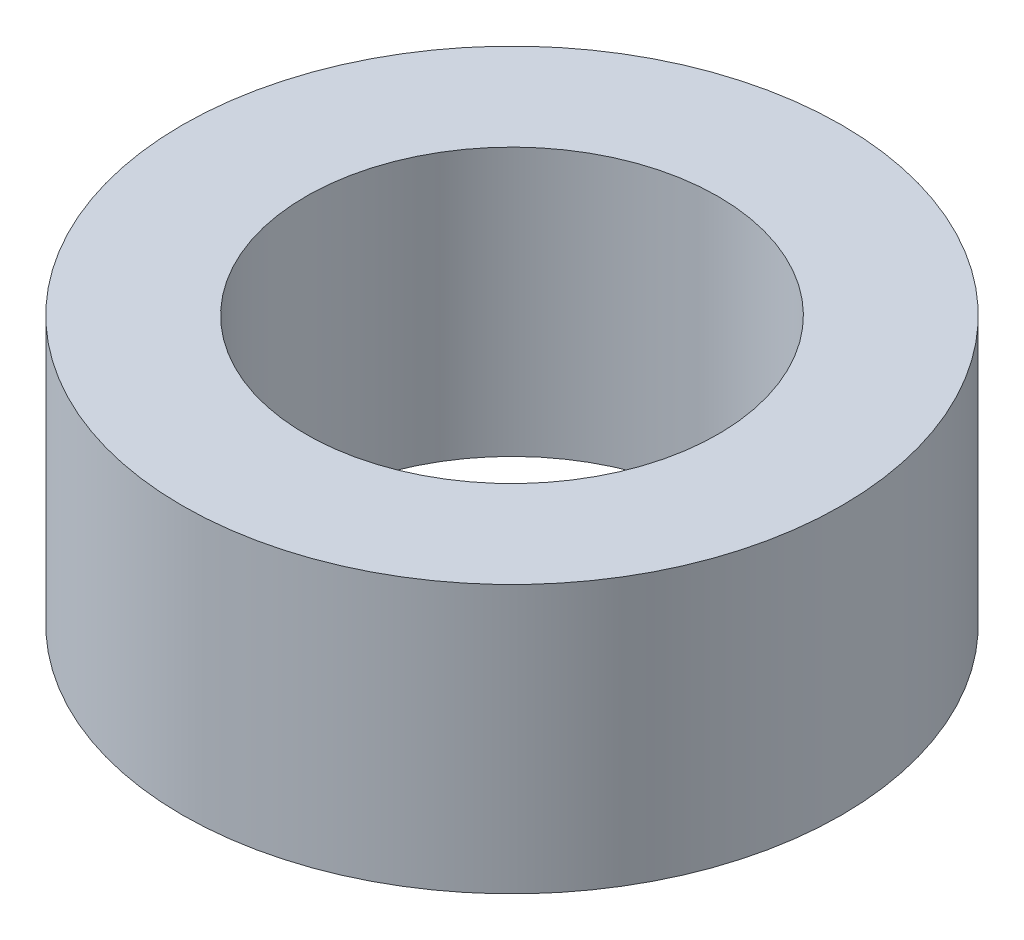
ISO-10303-21;
HEADER;
FILE_DESCRIPTION(('STEP AP214'),'2;1');
FILE_NAME('part.step','',(''),(''),'','','');
FILE_SCHEMA(('AUTOMOTIVE_DESIGN { 1 0 10303 214 1 1 1 1 }'));
ENDSEC;
DATA;
#1=APPLICATION_CONTEXT('core data for automotive mechanical design processes');
#2=APPLICATION_PROTOCOL_DEFINITION('international standard','automotive_design',2000,#1);
#3=PRODUCT_CONTEXT('',#1,'mechanical');
#4=PRODUCT('Part','Part','',(#3));
#5=PRODUCT_RELATED_PRODUCT_CATEGORY('part','',(#4));
#6=PRODUCT_DEFINITION_FORMATION('','',#4);
#7=PRODUCT_DEFINITION_CONTEXT('part definition',#1,'design');
#8=PRODUCT_DEFINITION('design','',#6,#7);
#9=PRODUCT_DEFINITION_SHAPE('','',#8);
#10=(LENGTH_UNIT() NAMED_UNIT(*) SI_UNIT(.MILLI.,.METRE.));
#11=(NAMED_UNIT(*) PLANE_ANGLE_UNIT() SI_UNIT($,.RADIAN.));
#12=(NAMED_UNIT(*) SI_UNIT($,.STERADIAN.) SOLID_ANGLE_UNIT());
#13=UNCERTAINTY_MEASURE_WITH_UNIT(LENGTH_MEASURE(1.E-05),#10,'distance_accuracy_value','');
#14=(GEOMETRIC_REPRESENTATION_CONTEXT(3) GLOBAL_UNCERTAINTY_ASSIGNED_CONTEXT((#13)) GLOBAL_UNIT_ASSIGNED_CONTEXT((#10,
#11,#12)) REPRESENTATION_CONTEXT('',''));
#15=CARTESIAN_POINT('',(0.,0.,0.));
#16=DIRECTION('',(0.,0.,1.));
#17=DIRECTION('',(1.,0.,0.));
#18=AXIS2_PLACEMENT_3D('',#15,#16,#17);
#19=CARTESIAN_POINT('',(0.,3.25,0.));
#20=DIRECTION('',(0.,1.,0.));
#21=DIRECTION('',(0.,0.,1.));
#22=AXIS2_PLACEMENT_3D('',#19,#20,#21);
#23=PLANE('',#22);
#24=CARTESIAN_POINT('',(0.,3.25,0.));
#25=DIRECTION('',(0.,1.,0.));
#26=DIRECTION('',(0.,0.,1.));
#27=AXIS2_PLACEMENT_3D('',#24,#25,#26);
#28=CIRCLE('',#27,4.);
#29=CARTESIAN_POINT('',(0.,3.25,-4.));
#30=VERTEX_POINT('',#29);
#31=EDGE_CURVE('E10',#30,#30,#28,.T.);
#32=ORIENTED_EDGE('',*,*,#31,.T.);
#33=EDGE_LOOP('',(#32));
#34=FACE_BOUND('',#33,.T.);
#35=CARTESIAN_POINT('',(0.,3.25,0.));
#36=DIRECTION('',(0.,1.,0.));
#37=DIRECTION('',(0.,0.,1.));
#38=AXIS2_PLACEMENT_3D('',#35,#36,#37);
#39=CIRCLE('',#38,2.5);
#40=CARTESIAN_POINT('',(0.,3.25,-2.5));
#41=VERTEX_POINT('',#40);
#42=EDGE_CURVE('E50',#41,#41,#39,.T.);
#43=ORIENTED_EDGE('',*,*,#42,.F.);
#44=EDGE_LOOP('',(#43));
#45=FACE_BOUND('',#44,.T.);
#46=ADVANCED_FACE('F37',(#34,#45),#23,.T.);
#47=CARTESIAN_POINT('',(0.,0.,0.));
#48=DIRECTION('',(0.,1.,0.));
#49=DIRECTION('',(0.,0.,1.));
#50=AXIS2_PLACEMENT_3D('',#47,#48,#49);
#51=PLANE('',#50);
#52=CARTESIAN_POINT('',(0.,0.,0.));
#53=DIRECTION('',(0.,1.,0.));
#54=DIRECTION('',(0.,0.,1.));
#55=AXIS2_PLACEMENT_3D('',#52,#53,#54);
#56=CIRCLE('',#55,4.);
#57=CARTESIAN_POINT('',(0.,0.,-4.));
#58=VERTEX_POINT('',#57);
#59=EDGE_CURVE('E41',#58,#58,#56,.T.);
#60=ORIENTED_EDGE('',*,*,#59,.F.);
#61=EDGE_LOOP('',(#60));
#62=FACE_BOUND('',#61,.T.);
#63=CARTESIAN_POINT('',(0.,0.,0.));
#64=DIRECTION('',(0.,1.,0.));
#65=DIRECTION('',(0.,0.,1.));
#66=AXIS2_PLACEMENT_3D('',#63,#64,#65);
#67=CIRCLE('',#66,2.5);
#68=CARTESIAN_POINT('',(0.,0.,-2.5));
#69=VERTEX_POINT('',#68);
#70=EDGE_CURVE('E52',#69,#69,#67,.T.);
#71=ORIENTED_EDGE('',*,*,#70,.T.);
#72=EDGE_LOOP('',(#71));
#73=FACE_BOUND('',#72,.T.);
#74=ADVANCED_FACE('F64',(#62,#73),#51,.F.);
#75=CARTESIAN_POINT('',(0.,3.25,0.));
#76=DIRECTION('',(0.,-1.,0.));
#77=DIRECTION('',(0.,0.,-1.));
#78=AXIS2_PLACEMENT_3D('',#75,#76,#77);
#79=CYLINDRICAL_SURFACE('',#78,4.);
#80=CARTESIAN_POINT('',(0.,3.25,-4.));
#81=CARTESIAN_POINT('',(0.,3.21614583333333,-4.));
#82=CARTESIAN_POINT('',(0.,3.18229166666667,-4.));
#83=CARTESIAN_POINT('',(0.,3.11458333333333,-4.));
#84=CARTESIAN_POINT('',(0.,3.08072916666667,-4.));
#85=CARTESIAN_POINT('',(0.,3.01302083333333,-4.));
#86=CARTESIAN_POINT('',(0.,2.97916666666667,-4.));
#87=CARTESIAN_POINT('',(0.,2.91145833333333,-4.));
#88=CARTESIAN_POINT('',(0.,2.87760416666667,-4.));
#89=CARTESIAN_POINT('',(0.,2.80989583333333,-4.));
#90=CARTESIAN_POINT('',(0.,2.77604166666667,-4.));
#91=CARTESIAN_POINT('',(0.,2.70833333333333,-4.));
#92=CARTESIAN_POINT('',(0.,2.67447916666667,-4.));
#93=CARTESIAN_POINT('',(0.,2.60677083333333,-4.));
#94=CARTESIAN_POINT('',(0.,2.57291666666667,-4.));
#95=CARTESIAN_POINT('',(0.,2.50520833333333,-4.));
#96=CARTESIAN_POINT('',(0.,2.47135416666667,-4.));
#97=CARTESIAN_POINT('',(0.,2.40364583333333,-4.));
#98=CARTESIAN_POINT('',(0.,2.36979166666667,-4.));
#99=CARTESIAN_POINT('',(0.,2.30208333333333,-4.));
#100=CARTESIAN_POINT('',(0.,2.26822916666667,-4.));
#101=CARTESIAN_POINT('',(0.,2.20052083333333,-4.));
#102=CARTESIAN_POINT('',(0.,2.16666666666667,-4.));
#103=CARTESIAN_POINT('',(0.,2.09895833333333,-4.));
#104=CARTESIAN_POINT('',(0.,2.06510416666667,-4.));
#105=CARTESIAN_POINT('',(0.,1.99739583333333,-4.));
#106=CARTESIAN_POINT('',(0.,1.96354166666667,-4.));
#107=CARTESIAN_POINT('',(0.,1.89583333333333,-4.));
#108=CARTESIAN_POINT('',(0.,1.86197916666667,-4.));
#109=CARTESIAN_POINT('',(0.,1.79427083333333,-4.));
#110=CARTESIAN_POINT('',(0.,1.76041666666667,-4.));
#111=CARTESIAN_POINT('',(0.,1.69270833333333,-4.));
#112=CARTESIAN_POINT('',(0.,1.65885416666667,-4.));
#113=CARTESIAN_POINT('',(0.,1.59114583333333,-4.));
#114=CARTESIAN_POINT('',(0.,1.55729166666667,-4.));
#115=CARTESIAN_POINT('',(0.,1.48958333333333,-4.));
#116=CARTESIAN_POINT('',(0.,1.45572916666667,-4.));
#117=CARTESIAN_POINT('',(0.,1.38802083333333,-4.));
#118=CARTESIAN_POINT('',(0.,1.35416666666667,-4.));
#119=CARTESIAN_POINT('',(0.,1.28645833333333,-4.));
#120=CARTESIAN_POINT('',(0.,1.25260416666667,-4.));
#121=CARTESIAN_POINT('',(0.,1.18489583333333,-4.));
#122=CARTESIAN_POINT('',(0.,1.15104166666667,-4.));
#123=CARTESIAN_POINT('',(0.,1.08333333333333,-4.));
#124=CARTESIAN_POINT('',(0.,1.04947916666667,-4.));
#125=CARTESIAN_POINT('',(0.,0.981770833333333,-4.));
#126=CARTESIAN_POINT('',(0.,0.947916666666667,-4.));
#127=CARTESIAN_POINT('',(0.,0.880208333333333,-4.));
#128=CARTESIAN_POINT('',(0.,0.846354166666667,-4.));
#129=CARTESIAN_POINT('',(0.,0.778645833333333,-4.));
#130=CARTESIAN_POINT('',(0.,0.744791666666667,-4.));
#131=CARTESIAN_POINT('',(0.,0.677083333333333,-4.));
#132=CARTESIAN_POINT('',(0.,0.643229166666667,-4.));
#133=CARTESIAN_POINT('',(0.,0.575520833333333,-4.));
#134=CARTESIAN_POINT('',(0.,0.541666666666667,-4.));
#135=CARTESIAN_POINT('',(0.,0.473958333333333,-4.));
#136=CARTESIAN_POINT('',(0.,0.440104166666667,-4.));
#137=CARTESIAN_POINT('',(0.,0.372395833333333,-4.));
#138=CARTESIAN_POINT('',(0.,0.338541666666667,-4.));
#139=CARTESIAN_POINT('',(0.,0.270833333333333,-4.));
#140=CARTESIAN_POINT('',(0.,0.236979166666667,-4.));
#141=CARTESIAN_POINT('',(0.,0.169270833333333,-4.));
#142=CARTESIAN_POINT('',(0.,0.135416666666667,-4.));
#143=CARTESIAN_POINT('',(0.,0.0677083333333334,-4.));
#144=CARTESIAN_POINT('',(0.,0.0338541666666667,-4.));
#145=CARTESIAN_POINT('',(0.,0.,-4.));
#146=B_SPLINE_CURVE_WITH_KNOTS('',3,(#80,#81,#82,#83,#84,#85,#86,#87,#88,#89,#90,#91,#92,#93,
#94,#95,#96,#97,#98,#99,#100,#101,#102,#103,#104,#105,#106,#107,#108,#109,#110,#111,#112,#113,
#114,#115,#116,#117,#118,#119,#120,#121,#122,#123,#124,#125,#126,#127,#128,#129,#130,#131,#132,
#133,#134,#135,#136,#137,#138,#139,#140,#141,#142,#143,#144,#145),.UNSPECIFIED.,.F.,.F.,(4,2,2,
2,2,2,2,2,2,2,2,2,2,2,2,2,2,2,2,2,2,2,2,2,2,2,2,2,2,2,2,2,4),(0.,0.1015625,0.203125,0.3046875,
0.40625,0.5078125,0.609375,0.7109375,0.8125,0.9140625,1.015625,1.1171875,1.21875,1.3203125,
1.421875,1.5234375,1.625,1.7265625,1.828125,1.9296875,2.03125,2.1328125,2.234375,2.3359375,
2.4375,2.5390625,2.640625,2.7421875,2.84375,2.9453125,3.046875,3.1484375,3.25),.UNSPECIFIED.);
#147=EDGE_CURVE('BSEAM39',#30,#58,#146,.T.);
#148=ORIENTED_EDGE('',*,*,#31,.F.);
#149=ORIENTED_EDGE('',*,*,#59,.T.);
#150=ORIENTED_EDGE('',*,*,#147,.T.);
#151=ORIENTED_EDGE('',*,*,#147,.F.);
#152=EDGE_LOOP('',(#148,#150,#149,#151));
#153=FACE_BOUND('',#152,.T.);
#154=ADVANCED_FACE('F39',(#153),#79,.T.);
#155=CARTESIAN_POINT('',(0.,3.25,0.));
#156=DIRECTION('',(0.,-1.,0.));
#157=DIRECTION('',(0.,0.,-1.));
#158=AXIS2_PLACEMENT_3D('',#155,#156,#157);
#159=CYLINDRICAL_SURFACE('',#158,2.5);
#160=CARTESIAN_POINT('',(0.,3.25,-2.5));
#161=CARTESIAN_POINT('',(0.,3.21614583333333,-2.5));
#162=CARTESIAN_POINT('',(0.,3.18229166666667,-2.5));
#163=CARTESIAN_POINT('',(0.,3.11458333333333,-2.5));
#164=CARTESIAN_POINT('',(0.,3.08072916666667,-2.5));
#165=CARTESIAN_POINT('',(0.,3.01302083333333,-2.5));
#166=CARTESIAN_POINT('',(0.,2.97916666666667,-2.5));
#167=CARTESIAN_POINT('',(0.,2.91145833333333,-2.5));
#168=CARTESIAN_POINT('',(0.,2.87760416666667,-2.5));
#169=CARTESIAN_POINT('',(0.,2.80989583333333,-2.5));
#170=CARTESIAN_POINT('',(0.,2.77604166666667,-2.5));
#171=CARTESIAN_POINT('',(0.,2.70833333333333,-2.5));
#172=CARTESIAN_POINT('',(0.,2.67447916666667,-2.5));
#173=CARTESIAN_POINT('',(0.,2.60677083333333,-2.5));
#174=CARTESIAN_POINT('',(0.,2.57291666666667,-2.5));
#175=CARTESIAN_POINT('',(0.,2.50520833333333,-2.5));
#176=CARTESIAN_POINT('',(0.,2.47135416666667,-2.5));
#177=CARTESIAN_POINT('',(0.,2.40364583333333,-2.5));
#178=CARTESIAN_POINT('',(0.,2.36979166666667,-2.5));
#179=CARTESIAN_POINT('',(0.,2.30208333333333,-2.5));
#180=CARTESIAN_POINT('',(0.,2.26822916666667,-2.5));
#181=CARTESIAN_POINT('',(0.,2.20052083333333,-2.5));
#182=CARTESIAN_POINT('',(0.,2.16666666666667,-2.5));
#183=CARTESIAN_POINT('',(0.,2.09895833333333,-2.5));
#184=CARTESIAN_POINT('',(0.,2.06510416666667,-2.5));
#185=CARTESIAN_POINT('',(0.,1.99739583333333,-2.5));
#186=CARTESIAN_POINT('',(0.,1.96354166666667,-2.5));
#187=CARTESIAN_POINT('',(0.,1.89583333333333,-2.5));
#188=CARTESIAN_POINT('',(0.,1.86197916666667,-2.5));
#189=CARTESIAN_POINT('',(0.,1.79427083333333,-2.5));
#190=CARTESIAN_POINT('',(0.,1.76041666666667,-2.5));
#191=CARTESIAN_POINT('',(0.,1.69270833333333,-2.5));
#192=CARTESIAN_POINT('',(0.,1.65885416666667,-2.5));
#193=CARTESIAN_POINT('',(0.,1.59114583333333,-2.5));
#194=CARTESIAN_POINT('',(0.,1.55729166666667,-2.5));
#195=CARTESIAN_POINT('',(0.,1.48958333333333,-2.5));
#196=CARTESIAN_POINT('',(0.,1.45572916666667,-2.5));
#197=CARTESIAN_POINT('',(0.,1.38802083333333,-2.5));
#198=CARTESIAN_POINT('',(0.,1.35416666666667,-2.5));
#199=CARTESIAN_POINT('',(0.,1.28645833333333,-2.5));
#200=CARTESIAN_POINT('',(0.,1.25260416666667,-2.5));
#201=CARTESIAN_POINT('',(0.,1.18489583333333,-2.5));
#202=CARTESIAN_POINT('',(0.,1.15104166666667,-2.5));
#203=CARTESIAN_POINT('',(0.,1.08333333333333,-2.5));
#204=CARTESIAN_POINT('',(0.,1.04947916666667,-2.5));
#205=CARTESIAN_POINT('',(0.,0.981770833333333,-2.5));
#206=CARTESIAN_POINT('',(0.,0.947916666666667,-2.5));
#207=CARTESIAN_POINT('',(0.,0.880208333333333,-2.5));
#208=CARTESIAN_POINT('',(0.,0.846354166666667,-2.5));
#209=CARTESIAN_POINT('',(0.,0.778645833333333,-2.5));
#210=CARTESIAN_POINT('',(0.,0.744791666666667,-2.5));
#211=CARTESIAN_POINT('',(0.,0.677083333333333,-2.5));
#212=CARTESIAN_POINT('',(0.,0.643229166666667,-2.5));
#213=CARTESIAN_POINT('',(0.,0.575520833333333,-2.5));
#214=CARTESIAN_POINT('',(0.,0.541666666666667,-2.5));
#215=CARTESIAN_POINT('',(0.,0.473958333333333,-2.5));
#216=CARTESIAN_POINT('',(0.,0.440104166666667,-2.5));
#217=CARTESIAN_POINT('',(0.,0.372395833333333,-2.5));
#218=CARTESIAN_POINT('',(0.,0.338541666666667,-2.5));
#219=CARTESIAN_POINT('',(0.,0.270833333333333,-2.5));
#220=CARTESIAN_POINT('',(0.,0.236979166666667,-2.5));
#221=CARTESIAN_POINT('',(0.,0.169270833333333,-2.5));
#222=CARTESIAN_POINT('',(0.,0.135416666666667,-2.5));
#223=CARTESIAN_POINT('',(0.,0.0677083333333334,-2.5));
#224=CARTESIAN_POINT('',(0.,0.0338541666666667,-2.5));
#225=CARTESIAN_POINT('',(0.,0.,-2.5));
#226=B_SPLINE_CURVE_WITH_KNOTS('',3,(#160,#161,#162,#163,#164,#165,#166,#167,#168,#169,#170,
#171,#172,#173,#174,#175,#176,#177,#178,#179,#180,#181,#182,#183,#184,#185,#186,#187,#188,#189,
#190,#191,#192,#193,#194,#195,#196,#197,#198,#199,#200,#201,#202,#203,#204,#205,#206,#207,#208,
#209,#210,#211,#212,#213,#214,#215,#216,#217,#218,#219,#220,#221,#222,#223,#224,#225),
.UNSPECIFIED.,.F.,.F.,(4,2,2,2,2,2,2,2,2,2,2,2,2,2,2,2,2,2,2,2,2,2,2,2,2,2,2,2,2,2,2,2,4),(0.,
0.1015625,0.203125,0.3046875,0.40625,0.5078125,0.609375,0.7109375,0.8125,0.9140625,1.015625,
1.1171875,1.21875,1.3203125,1.421875,1.5234375,1.625,1.7265625,1.828125,1.9296875,2.03125,
2.1328125,2.234375,2.3359375,2.4375,2.5390625,2.640625,2.7421875,2.84375,2.9453125,3.046875,
3.1484375,3.25),.UNSPECIFIED.);
#227=EDGE_CURVE('BSEAM60',#41,#69,#226,.T.);
#228=ORIENTED_EDGE('',*,*,#42,.T.);
#229=ORIENTED_EDGE('',*,*,#70,.F.);
#230=ORIENTED_EDGE('',*,*,#227,.T.);
#231=ORIENTED_EDGE('',*,*,#227,.F.);
#232=EDGE_LOOP('',(#228,#230,#229,#231));
#233=FACE_BOUND('',#232,.T.);
#234=ADVANCED_FACE('F60',(#233),#159,.F.);
#235=CLOSED_SHELL('',(#46,#74,#154,#234));
#236=MANIFOLD_SOLID_BREP('B2',#235);
#237=ADVANCED_BREP_SHAPE_REPRESENTATION('',(#18,#236),#14);
#238=SHAPE_DEFINITION_REPRESENTATION(#9,#237);
ENDSEC;
END-ISO-10303-21;
